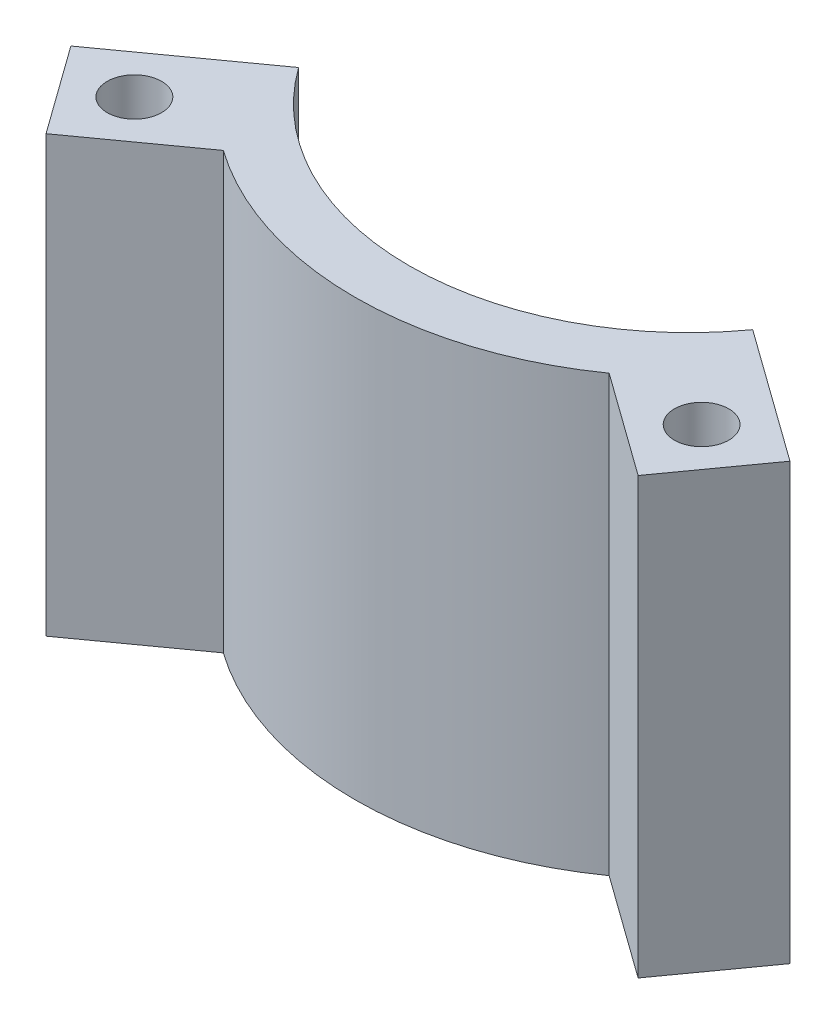
ISO-10303-21;
HEADER;
FILE_DESCRIPTION(('STEP AP214'),'2;1');
FILE_NAME('part.step','',(''),(''),'','','');
FILE_SCHEMA(('AUTOMOTIVE_DESIGN { 1 0 10303 214 1 1 1 1 }'));
ENDSEC;
DATA;
#1=APPLICATION_CONTEXT('core data for automotive mechanical design processes');
#2=APPLICATION_PROTOCOL_DEFINITION('international standard','automotive_design',2000,#1);
#3=PRODUCT_CONTEXT('',#1,'mechanical');
#4=PRODUCT('Part','Part','',(#3));
#5=PRODUCT_RELATED_PRODUCT_CATEGORY('part','',(#4));
#6=PRODUCT_DEFINITION_FORMATION('','',#4);
#7=PRODUCT_DEFINITION_CONTEXT('part definition',#1,'design');
#8=PRODUCT_DEFINITION('design','',#6,#7);
#9=PRODUCT_DEFINITION_SHAPE('','',#8);
#10=(LENGTH_UNIT() NAMED_UNIT(*) SI_UNIT(.MILLI.,.METRE.));
#11=(NAMED_UNIT(*) PLANE_ANGLE_UNIT() SI_UNIT($,.RADIAN.));
#12=(NAMED_UNIT(*) SI_UNIT($,.STERADIAN.) SOLID_ANGLE_UNIT());
#13=UNCERTAINTY_MEASURE_WITH_UNIT(LENGTH_MEASURE(1.E-05),#10,'distance_accuracy_value','');
#14=(GEOMETRIC_REPRESENTATION_CONTEXT(3) GLOBAL_UNCERTAINTY_ASSIGNED_CONTEXT((#13)) GLOBAL_UNIT_ASSIGNED_CONTEXT((#10,
#11,#12)) REPRESENTATION_CONTEXT('',''));
#15=CARTESIAN_POINT('',(0.,0.,0.));
#16=DIRECTION('',(0.,0.,1.));
#17=DIRECTION('',(1.,0.,0.));
#18=AXIS2_PLACEMENT_3D('',#15,#16,#17);
#19=CARTESIAN_POINT('',(71.,45.,-46.7332857821917));
#20=DIRECTION('',(0.,-1.,0.));
#21=DIRECTION('',(0.,0.,-1.));
#22=AXIS2_PLACEMENT_3D('',#19,#20,#21);
#23=PLANE('',#22);
#24=CARTESIAN_POINT('',(-26.0701081162833,45.,24.896575322829));
#25=DIRECTION('',(0.,-1.,0.));
#26=DIRECTION('',(0.,0.,-1.));
#27=AXIS2_PLACEMENT_3D('',#24,#25,#26);
#28=CIRCLE('',#27,2.5);
#29=CARTESIAN_POINT('',(-26.0701081162833,45.,22.396575322829));
#30=VERTEX_POINT('',#29);
#31=EDGE_CURVE('E158',#30,#30,#28,.T.);
#32=ORIENTED_EDGE('',*,*,#31,.T.);
#33=EDGE_LOOP('',(#32));
#34=FACE_BOUND('',#33,.T.);
#35=CARTESIAN_POINT('',(26.0701081162833,45.,24.896575322829));
#36=DIRECTION('',(0.,-1.,0.));
#37=DIRECTION('',(0.,0.,-1.));
#38=AXIS2_PLACEMENT_3D('',#35,#36,#37);
#39=CIRCLE('',#38,2.5);
#40=CARTESIAN_POINT('',(26.0701081162833,45.,22.396575322829));
#41=VERTEX_POINT('',#40);
#42=EDGE_CURVE('E159',#41,#41,#39,.T.);
#43=ORIENTED_EDGE('',*,*,#42,.T.);
#44=EDGE_LOOP('',(#43));
#45=FACE_BOUND('',#44,.T.);
#46=DIRECTION('',(0.811999889468529,0.,0.583657587548638));
#47=VECTOR('',#46,1.);
#48=CARTESIAN_POINT('',(-5.83657587548637,45.,8.11999889468529));
#49=LINE('',#48,#47);
#50=CARTESIAN_POINT('',(17.732271685021,45.,25.0610562604333));
#51=VERTEX_POINT('',#50);
#52=CARTESIAN_POINT('',(27.2118196258828,45.,31.8748627079149));
#53=VERTEX_POINT('',#52);
#54=EDGE_CURVE('E43',#51,#53,#49,.T.);
#55=ORIENTED_EDGE('',*,*,#54,.T.);
#56=DIRECTION('',(0.583657587548638,0.,-0.81199988946853));
#57=VECTOR('',#56,1.);
#58=CARTESIAN_POINT('',(33.0483955013692,45.,23.7548638132296));
#59=LINE('',#58,#57);
#60=CARTESIAN_POINT('',(33.0483955013692,45.,23.7548638132296));
#61=VERTEX_POINT('',#60);
#62=EDGE_CURVE('E127',#53,#61,#59,.T.);
#63=ORIENTED_EDGE('',*,*,#62,.T.);
#64=DIRECTION('',(-0.811999889468532,0.,-0.583657587548635));
#65=VECTOR('',#64,1.);
#66=CARTESIAN_POINT('',(0.,45.,0.));
#67=LINE('',#66,#65);
#68=CARTESIAN_POINT('',(20.8683971593412,45.,15.));
#69=VERTEX_POINT('',#68);
#70=EDGE_CURVE('E174',#61,#69,#67,.T.);
#71=ORIENTED_EDGE('',*,*,#70,.T.);
#72=CARTESIAN_POINT('',(0.,45.,0.));
#73=DIRECTION('',(0.,1.,0.));
#74=DIRECTION('',(0.,0.,1.));
#75=AXIS2_PLACEMENT_3D('',#72,#73,#74);
#76=CIRCLE('',#75,25.7);
#77=CARTESIAN_POINT('',(-20.8683971593412,45.,15.));
#78=VERTEX_POINT('',#77);
#79=EDGE_CURVE('E163',#69,#78,#76,.F.);
#80=ORIENTED_EDGE('',*,*,#79,.T.);
#81=DIRECTION('',(0.81199988946853,0.,-0.583657587548637));
#82=VECTOR('',#81,1.);
#83=CARTESIAN_POINT('',(0.,45.,0.));
#84=LINE('',#83,#82);
#85=CARTESIAN_POINT('',(-33.0483955013691,45.,23.7548638132295));
#86=VERTEX_POINT('',#85);
#87=EDGE_CURVE('E180',#86,#78,#84,.T.);
#88=ORIENTED_EDGE('',*,*,#87,.F.);
#89=DIRECTION('',(-0.58365758754864,0.,-0.811999889468528));
#90=VECTOR('',#89,1.);
#91=CARTESIAN_POINT('',(-33.0483955013691,45.,23.7548638132297));
#92=LINE('',#91,#90);
#93=CARTESIAN_POINT('',(-27.2118196258827,45.,31.8748627079149));
#94=VERTEX_POINT('',#93);
#95=EDGE_CURVE('E183',#94,#86,#92,.T.);
#96=ORIENTED_EDGE('',*,*,#95,.F.);
#97=DIRECTION('',(-0.811999889468528,0.,0.583657587548641));
#98=VECTOR('',#97,1.);
#99=CARTESIAN_POINT('',(5.83657587548635,45.,8.11999889468519));
#100=LINE('',#99,#98);
#101=CARTESIAN_POINT('',(-17.732271685021,45.,25.0610562604333));
#102=VERTEX_POINT('',#101);
#103=EDGE_CURVE('E169',#102,#94,#100,.T.);
#104=ORIENTED_EDGE('',*,*,#103,.F.);
#105=CARTESIAN_POINT('',(0.,45.,0.));
#106=DIRECTION('',(0.,1.,0.));
#107=DIRECTION('',(0.,0.,1.));
#108=AXIS2_PLACEMENT_3D('',#105,#106,#107);
#109=CIRCLE('',#108,30.7);
#110=EDGE_CURVE('E133',#51,#102,#109,.F.);
#111=ORIENTED_EDGE('',*,*,#110,.F.);
#112=EDGE_LOOP('',(#55,#63,#71,#80,#88,#96,#104,#111));
#113=FACE_BOUND('',#112,.T.);
#114=ADVANCED_FACE('F40',(#34,#45,#113),#23,.F.);
#115=CARTESIAN_POINT('',(0.,5.,72.5));
#116=DIRECTION('',(0.,1.,0.));
#117=DIRECTION('',(0.,0.,1.));
#118=AXIS2_PLACEMENT_3D('',#115,#116,#117);
#119=PLANE('',#118);
#120=CARTESIAN_POINT('',(-26.0701081162833,5.,24.896575322829));
#121=DIRECTION('',(0.,1.,0.));
#122=DIRECTION('',(0.,0.,1.));
#123=AXIS2_PLACEMENT_3D('',#120,#121,#122);
#124=CIRCLE('',#123,2.5);
#125=CARTESIAN_POINT('',(-26.0701081162833,5.,27.396575322829));
#126=VERTEX_POINT('',#125);
#127=EDGE_CURVE('E155',#126,#126,#124,.T.);
#128=ORIENTED_EDGE('',*,*,#127,.T.);
#129=EDGE_LOOP('',(#128));
#130=FACE_BOUND('',#129,.T.);
#131=CARTESIAN_POINT('',(26.0701081162833,5.,24.896575322829));
#132=DIRECTION('',(0.,1.,0.));
#133=DIRECTION('',(0.,0.,1.));
#134=AXIS2_PLACEMENT_3D('',#131,#132,#133);
#135=CIRCLE('',#134,2.5);
#136=CARTESIAN_POINT('',(26.0701081162833,5.,27.396575322829));
#137=VERTEX_POINT('',#136);
#138=EDGE_CURVE('E160',#137,#137,#135,.T.);
#139=ORIENTED_EDGE('',*,*,#138,.T.);
#140=EDGE_LOOP('',(#139));
#141=FACE_BOUND('',#140,.T.);
#142=DIRECTION('',(0.811999889468528,0.,-0.583657587548641));
#143=VECTOR('',#142,1.);
#144=CARTESIAN_POINT('',(5.83657587548635,5.,8.11999889468519));
#145=LINE('',#144,#143);
#146=CARTESIAN_POINT('',(-27.2118196258827,5.,31.8748627079149));
#147=VERTEX_POINT('',#146);
#148=CARTESIAN_POINT('',(-17.732271685021,5.,25.0610562604333));
#149=VERTEX_POINT('',#148);
#150=EDGE_CURVE('E148',#147,#149,#145,.T.);
#151=ORIENTED_EDGE('',*,*,#150,.F.);
#152=DIRECTION('',(0.58365758754864,0.,0.811999889468528));
#153=VECTOR('',#152,1.);
#154=CARTESIAN_POINT('',(-33.0483955013691,5.,23.7548638132297));
#155=LINE('',#154,#153);
#156=CARTESIAN_POINT('',(-33.0483955013691,5.,23.7548638132296));
#157=VERTEX_POINT('',#156);
#158=EDGE_CURVE('E151',#157,#147,#155,.T.);
#159=ORIENTED_EDGE('',*,*,#158,.F.);
#160=DIRECTION('',(-0.81199988946853,0.,0.583657587548637));
#161=VECTOR('',#160,1.);
#162=CARTESIAN_POINT('',(0.,5.,0.));
#163=LINE('',#162,#161);
#164=CARTESIAN_POINT('',(-20.8683971593412,5.,15.));
#165=VERTEX_POINT('',#164);
#166=EDGE_CURVE('E48',#165,#157,#163,.T.);
#167=ORIENTED_EDGE('',*,*,#166,.F.);
#168=CARTESIAN_POINT('',(0.,5.,0.));
#169=DIRECTION('',(0.,1.,0.));
#170=DIRECTION('',(0.,0.,1.));
#171=AXIS2_PLACEMENT_3D('',#168,#169,#170);
#172=CIRCLE('',#171,25.7);
#173=CARTESIAN_POINT('',(20.8683971593412,5.,15.));
#174=VERTEX_POINT('',#173);
#175=EDGE_CURVE('E164',#165,#174,#172,.T.);
#176=ORIENTED_EDGE('',*,*,#175,.T.);
#177=DIRECTION('',(0.811999889468532,0.,0.583657587548635));
#178=VECTOR('',#177,1.);
#179=CARTESIAN_POINT('',(0.,5.,0.));
#180=LINE('',#179,#178);
#181=CARTESIAN_POINT('',(33.0483955013691,5.,23.7548638132296));
#182=VERTEX_POINT('',#181);
#183=EDGE_CURVE('E120',#174,#182,#180,.T.);
#184=ORIENTED_EDGE('',*,*,#183,.T.);
#185=DIRECTION('',(-0.583657587548638,0.,0.81199988946853));
#186=VECTOR('',#185,1.);
#187=CARTESIAN_POINT('',(33.0483955013692,5.,23.7548638132295));
#188=LINE('',#187,#186);
#189=CARTESIAN_POINT('',(27.2118196258828,5.,31.8748627079149));
#190=VERTEX_POINT('',#189);
#191=EDGE_CURVE('E114',#182,#190,#188,.T.);
#192=ORIENTED_EDGE('',*,*,#191,.T.);
#193=DIRECTION('',(-0.811999889468529,0.,-0.583657587548638));
#194=VECTOR('',#193,1.);
#195=CARTESIAN_POINT('',(-5.83657587548637,5.,8.11999889468529));
#196=LINE('',#195,#194);
#197=CARTESIAN_POINT('',(17.732271685021,5.,25.0610562604333));
#198=VERTEX_POINT('',#197);
#199=EDGE_CURVE('E106',#190,#198,#196,.T.);
#200=ORIENTED_EDGE('',*,*,#199,.T.);
#201=CARTESIAN_POINT('',(0.,5.,0.));
#202=DIRECTION('',(0.,1.,0.));
#203=DIRECTION('',(0.,0.,1.));
#204=AXIS2_PLACEMENT_3D('',#201,#202,#203);
#205=CIRCLE('',#204,30.7);
#206=EDGE_CURVE('E11',#149,#198,#205,.T.);
#207=ORIENTED_EDGE('',*,*,#206,.F.);
#208=EDGE_LOOP('',(#151,#159,#167,#176,#184,#192,#200,#207));
#209=FACE_BOUND('',#208,.T.);
#210=ADVANCED_FACE('F118',(#130,#141,#209),#119,.F.);
#211=CARTESIAN_POINT('',(26.0701081162833,118.216909723841,24.896575322829));
#212=DIRECTION('',(0.,-1.,0.));
#213=DIRECTION('',(0.,0.,-1.));
#214=AXIS2_PLACEMENT_3D('',#211,#212,#213);
#215=CYLINDRICAL_SURFACE('',#214,2.5);
#216=ORIENTED_EDGE('',*,*,#42,.F.);
#217=EDGE_LOOP('',(#216));
#218=FACE_BOUND('',#217,.T.);
#219=ORIENTED_EDGE('',*,*,#138,.F.);
#220=EDGE_LOOP('',(#219));
#221=FACE_BOUND('',#220,.T.);
#222=ADVANCED_FACE('F211',(#218,#221),#215,.F.);
#223=CARTESIAN_POINT('',(-26.0701081162833,118.216909723841,24.896575322829));
#224=DIRECTION('',(0.,-1.,0.));
#225=DIRECTION('',(0.,0.,-1.));
#226=AXIS2_PLACEMENT_3D('',#223,#224,#225);
#227=CYLINDRICAL_SURFACE('',#226,2.5);
#228=ORIENTED_EDGE('',*,*,#31,.F.);
#229=EDGE_LOOP('',(#228));
#230=FACE_BOUND('',#229,.T.);
#231=ORIENTED_EDGE('',*,*,#127,.F.);
#232=EDGE_LOOP('',(#231));
#233=FACE_BOUND('',#232,.T.);
#234=ADVANCED_FACE('F219',(#230,#233),#227,.F.);
#235=CARTESIAN_POINT('',(-5.83657587548637,118.216909723841,8.11999889468529));
#236=DIRECTION('',(-0.583657587548638,0.,0.81199988946853));
#237=DIRECTION('',(0.811999889468529,0.,0.583657587548638));
#238=AXIS2_PLACEMENT_3D('',#235,#236,#237);
#239=PLANE('',#238);
#240=ORIENTED_EDGE('',*,*,#54,.F.);
#241=DIRECTION('',(0.,-1.,0.));
#242=VECTOR('',#241,1.);
#243=CARTESIAN_POINT('',(17.732271685021,118.216909723841,25.0610562604333));
#244=LINE('',#243,#242);
#245=EDGE_CURVE('E112',#51,#198,#244,.T.);
#246=ORIENTED_EDGE('',*,*,#245,.T.);
#247=ORIENTED_EDGE('',*,*,#199,.F.);
#248=DIRECTION('',(0.,-1.,0.));
#249=VECTOR('',#248,1.);
#250=CARTESIAN_POINT('',(27.2118196258828,118.216909723841,31.8748627079149));
#251=LINE('',#250,#249);
#252=EDGE_CURVE('E111',#53,#190,#251,.T.);
#253=ORIENTED_EDGE('',*,*,#252,.F.);
#254=EDGE_LOOP('',(#240,#246,#247,#253));
#255=FACE_BOUND('',#254,.T.);
#256=ADVANCED_FACE('F109',(#255),#239,.T.);
#257=CARTESIAN_POINT('',(33.0483955013692,118.216909723841,23.7548638132295));
#258=DIRECTION('',(0.81199988946853,0.,0.583657587548637));
#259=DIRECTION('',(0.583657587548638,0.,-0.81199988946853));
#260=AXIS2_PLACEMENT_3D('',#257,#258,#259);
#261=PLANE('',#260);
#262=ORIENTED_EDGE('',*,*,#62,.F.);
#263=ORIENTED_EDGE('',*,*,#252,.T.);
#264=ORIENTED_EDGE('',*,*,#191,.F.);
#265=DIRECTION('',(0.,-1.,0.));
#266=VECTOR('',#265,1.);
#267=CARTESIAN_POINT('',(33.0483955013691,118.216909723841,23.7548638132296));
#268=LINE('',#267,#266);
#269=EDGE_CURVE('E129',#61,#182,#268,.T.);
#270=ORIENTED_EDGE('',*,*,#269,.F.);
#271=EDGE_LOOP('',(#262,#263,#264,#270));
#272=FACE_BOUND('',#271,.T.);
#273=ADVANCED_FACE('F125',(#272),#261,.T.);
#274=CARTESIAN_POINT('',(0.,118.216909723841,0.));
#275=DIRECTION('',(0.583657587548635,0.,-0.811999889468531));
#276=DIRECTION('',(-0.811999889468532,0.,-0.583657587548635));
#277=AXIS2_PLACEMENT_3D('',#274,#275,#276);
#278=PLANE('',#277);
#279=ORIENTED_EDGE('',*,*,#70,.F.);
#280=ORIENTED_EDGE('',*,*,#269,.T.);
#281=ORIENTED_EDGE('',*,*,#183,.F.);
#282=DIRECTION('',(0.,-1.,0.));
#283=VECTOR('',#282,1.);
#284=CARTESIAN_POINT('',(20.8683971593412,118.216909723841,15.));
#285=LINE('',#284,#283);
#286=EDGE_CURVE('E131',#69,#174,#285,.T.);
#287=ORIENTED_EDGE('',*,*,#286,.F.);
#288=EDGE_LOOP('',(#279,#280,#281,#287));
#289=FACE_BOUND('',#288,.T.);
#290=ADVANCED_FACE('F197',(#289),#278,.T.);
#291=CARTESIAN_POINT('',(0.,118.216909723841,0.));
#292=DIRECTION('',(0.,-1.,0.));
#293=DIRECTION('',(0.,0.,-1.));
#294=AXIS2_PLACEMENT_3D('',#291,#292,#293);
#295=CYLINDRICAL_SURFACE('',#294,25.7);
#296=ORIENTED_EDGE('',*,*,#79,.F.);
#297=ORIENTED_EDGE('',*,*,#286,.T.);
#298=ORIENTED_EDGE('',*,*,#175,.F.);
#299=DIRECTION('',(0.,-1.,0.));
#300=VECTOR('',#299,1.);
#301=CARTESIAN_POINT('',(-20.8683971593412,118.216909723841,15.));
#302=LINE('',#301,#300);
#303=EDGE_CURVE('E139',#78,#165,#302,.T.);
#304=ORIENTED_EDGE('',*,*,#303,.F.);
#305=EDGE_LOOP('',(#296,#297,#298,#304));
#306=FACE_BOUND('',#305,.T.);
#307=ADVANCED_FACE('F195',(#306),#295,.F.);
#308=CARTESIAN_POINT('',(0.,118.216909723841,0.));
#309=DIRECTION('',(0.583657587548637,0.,0.81199988946853));
#310=DIRECTION('',(0.81199988946853,0.,-0.583657587548637));
#311=AXIS2_PLACEMENT_3D('',#308,#309,#310);
#312=PLANE('',#311);
#313=DIRECTION('',(0.,-1.,0.));
#314=VECTOR('',#313,1.);
#315=CARTESIAN_POINT('',(-33.0483955013691,118.216909723841,23.7548638132296));
#316=LINE('',#315,#314);
#317=EDGE_CURVE('E141',#86,#157,#316,.T.);
#318=ORIENTED_EDGE('',*,*,#317,.F.);
#319=ORIENTED_EDGE('',*,*,#87,.T.);
#320=ORIENTED_EDGE('',*,*,#303,.T.);
#321=ORIENTED_EDGE('',*,*,#166,.T.);
#322=EDGE_LOOP('',(#318,#319,#320,#321));
#323=FACE_BOUND('',#322,.T.);
#324=ADVANCED_FACE('F190',(#323),#312,.F.);
#325=CARTESIAN_POINT('',(-33.0483955013691,118.216909723841,23.7548638132297));
#326=DIRECTION('',(0.811999889468528,0.,-0.58365758754864));
#327=DIRECTION('',(-0.58365758754864,0.,-0.811999889468528));
#328=AXIS2_PLACEMENT_3D('',#325,#326,#327);
#329=PLANE('',#328);
#330=DIRECTION('',(0.,-1.,0.));
#331=VECTOR('',#330,1.);
#332=CARTESIAN_POINT('',(-27.2118196258827,118.216909723841,31.8748627079149));
#333=LINE('',#332,#331);
#334=EDGE_CURVE('E144',#94,#147,#333,.T.);
#335=ORIENTED_EDGE('',*,*,#334,.F.);
#336=ORIENTED_EDGE('',*,*,#95,.T.);
#337=ORIENTED_EDGE('',*,*,#317,.T.);
#338=ORIENTED_EDGE('',*,*,#158,.T.);
#339=EDGE_LOOP('',(#335,#336,#337,#338));
#340=FACE_BOUND('',#339,.T.);
#341=ADVANCED_FACE('F189',(#340),#329,.F.);
#342=CARTESIAN_POINT('',(0.,118.216909723841,0.));
#343=DIRECTION('',(0.,-1.,0.));
#344=DIRECTION('',(0.,0.,-1.));
#345=AXIS2_PLACEMENT_3D('',#342,#343,#344);
#346=CYLINDRICAL_SURFACE('',#345,30.7);
#347=ORIENTED_EDGE('',*,*,#245,.F.);
#348=ORIENTED_EDGE('',*,*,#110,.T.);
#349=DIRECTION('',(0.,-1.,0.));
#350=VECTOR('',#349,1.);
#351=CARTESIAN_POINT('',(-17.732271685021,118.216909723841,25.0610562604333));
#352=LINE('',#351,#350);
#353=EDGE_CURVE('E147',#102,#149,#352,.T.);
#354=ORIENTED_EDGE('',*,*,#353,.T.);
#355=ORIENTED_EDGE('',*,*,#206,.T.);
#356=EDGE_LOOP('',(#347,#348,#354,#355));
#357=FACE_BOUND('',#356,.T.);
#358=ADVANCED_FACE('F178',(#357),#346,.T.);
#359=CARTESIAN_POINT('',(5.83657587548635,118.216909723841,8.11999889468519));
#360=DIRECTION('',(-0.58365758754864,0.,-0.811999889468527));
#361=DIRECTION('',(-0.811999889468528,0.,0.583657587548641));
#362=AXIS2_PLACEMENT_3D('',#359,#360,#361);
#363=PLANE('',#362);
#364=ORIENTED_EDGE('',*,*,#353,.F.);
#365=ORIENTED_EDGE('',*,*,#103,.T.);
#366=ORIENTED_EDGE('',*,*,#334,.T.);
#367=ORIENTED_EDGE('',*,*,#150,.T.);
#368=EDGE_LOOP('',(#364,#365,#366,#367));
#369=FACE_BOUND('',#368,.T.);
#370=ADVANCED_FACE('F187',(#369),#363,.F.);
#371=CLOSED_SHELL('',(#114,#210,#222,#234,#256,#273,#290,#307,#324,#341,#358,#370));
#372=MANIFOLD_SOLID_BREP('B2',#371);
#373=ADVANCED_BREP_SHAPE_REPRESENTATION('',(#18,#372),#14);
#374=SHAPE_DEFINITION_REPRESENTATION(#9,#373);
ENDSEC;
END-ISO-10303-21;
